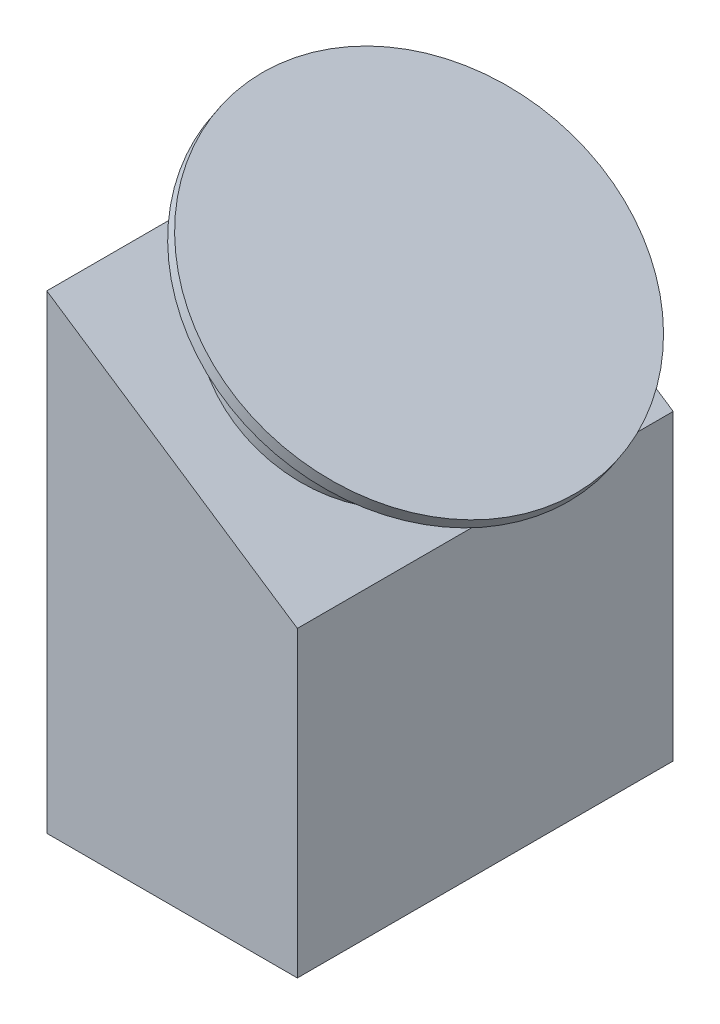
ISO-10303-21;
HEADER;
FILE_DESCRIPTION(('STEP AP214'),'2;1');
FILE_NAME('part.step','',(''),(''),'','','');
FILE_SCHEMA(('AUTOMOTIVE_DESIGN { 1 0 10303 214 1 1 1 1 }'));
ENDSEC;
DATA;
#1=APPLICATION_CONTEXT('core data for automotive mechanical design processes');
#2=APPLICATION_PROTOCOL_DEFINITION('international standard','automotive_design',2000,#1);
#3=PRODUCT_CONTEXT('',#1,'mechanical');
#4=PRODUCT('Part','Part','',(#3));
#5=PRODUCT_RELATED_PRODUCT_CATEGORY('part','',(#4));
#6=PRODUCT_DEFINITION_FORMATION('','',#4);
#7=PRODUCT_DEFINITION_CONTEXT('part definition',#1,'design');
#8=PRODUCT_DEFINITION('design','',#6,#7);
#9=PRODUCT_DEFINITION_SHAPE('','',#8);
#10=(LENGTH_UNIT() NAMED_UNIT(*) SI_UNIT(.MILLI.,.METRE.));
#11=(NAMED_UNIT(*) PLANE_ANGLE_UNIT() SI_UNIT($,.RADIAN.));
#12=(NAMED_UNIT(*) SI_UNIT($,.STERADIAN.) SOLID_ANGLE_UNIT());
#13=UNCERTAINTY_MEASURE_WITH_UNIT(LENGTH_MEASURE(1.E-05),#10,'distance_accuracy_value','');
#14=(GEOMETRIC_REPRESENTATION_CONTEXT(3) GLOBAL_UNCERTAINTY_ASSIGNED_CONTEXT((#13)) GLOBAL_UNIT_ASSIGNED_CONTEXT((#10,
#11,#12)) REPRESENTATION_CONTEXT('',''));
#15=CARTESIAN_POINT('',(0.,0.,0.));
#16=DIRECTION('',(0.,0.,1.));
#17=DIRECTION('',(1.,0.,0.));
#18=AXIS2_PLACEMENT_3D('',#15,#16,#17);
#19=CARTESIAN_POINT('',(0.,-75.,120.));
#20=DIRECTION('',(0.,1.,0.));
#21=DIRECTION('',(0.,0.,1.));
#22=AXIS2_PLACEMENT_3D('',#19,#20,#21);
#23=PLANE('',#22);
#24=DIRECTION('',(1.,0.,0.));
#25=VECTOR('',#24,1.);
#26=CARTESIAN_POINT('',(0.,-75.,0.));
#27=LINE('',#26,#25);
#28=CARTESIAN_POINT('',(-40.,-75.,0.));
#29=VERTEX_POINT('',#28);
#30=CARTESIAN_POINT('',(40.,-75.,0.));
#31=VERTEX_POINT('',#30);
#32=EDGE_CURVE('E150',#29,#31,#27,.T.);
#33=ORIENTED_EDGE('',*,*,#32,.T.);
#34=DIRECTION('',(0.,0.,-1.));
#35=VECTOR('',#34,1.);
#36=CARTESIAN_POINT('',(40.,-75.,120.));
#37=LINE('',#36,#35);
#38=CARTESIAN_POINT('',(40.,-75.,120.));
#39=VERTEX_POINT('',#38);
#40=EDGE_CURVE('E142',#39,#31,#37,.T.);
#41=ORIENTED_EDGE('',*,*,#40,.F.);
#42=DIRECTION('',(1.,0.,0.));
#43=VECTOR('',#42,1.);
#44=CARTESIAN_POINT('',(0.,-75.,120.));
#45=LINE('',#44,#43);
#46=CARTESIAN_POINT('',(-40.,-75.,120.));
#47=VERTEX_POINT('',#46);
#48=EDGE_CURVE('E133',#47,#39,#45,.T.);
#49=ORIENTED_EDGE('',*,*,#48,.F.);
#50=DIRECTION('',(0.,0.,-1.));
#51=VECTOR('',#50,1.);
#52=CARTESIAN_POINT('',(-40.,-75.,120.));
#53=LINE('',#52,#51);
#54=EDGE_CURVE('E99',#47,#29,#53,.T.);
#55=ORIENTED_EDGE('',*,*,#54,.T.);
#56=EDGE_LOOP('',(#33,#41,#49,#55));
#57=FACE_BOUND('',#56,.T.);
#58=ADVANCED_FACE('F40',(#57),#23,.F.);
#59=CARTESIAN_POINT('',(40.,0.,120.));
#60=DIRECTION('',(-1.,0.,0.));
#61=DIRECTION('',(0.,0.,1.));
#62=AXIS2_PLACEMENT_3D('',#59,#60,#61);
#63=PLANE('',#62);
#64=DIRECTION('',(0.,1.,0.));
#65=VECTOR('',#64,1.);
#66=CARTESIAN_POINT('',(40.,0.,0.));
#67=LINE('',#66,#65);
#68=CARTESIAN_POINT('',(40.,21.6666666666666,0.));
#69=VERTEX_POINT('',#68);
#70=EDGE_CURVE('E139',#31,#69,#67,.T.);
#71=ORIENTED_EDGE('',*,*,#70,.T.);
#72=DIRECTION('',(0.,0.,-1.));
#73=VECTOR('',#72,1.);
#74=CARTESIAN_POINT('',(40.,21.6666666666666,120.));
#75=LINE('',#74,#73);
#76=CARTESIAN_POINT('',(40.,21.6666666666666,120.));
#77=VERTEX_POINT('',#76);
#78=EDGE_CURVE('E137',#77,#69,#75,.T.);
#79=ORIENTED_EDGE('',*,*,#78,.F.);
#80=DIRECTION('',(0.,1.,0.));
#81=VECTOR('',#80,1.);
#82=CARTESIAN_POINT('',(40.,0.,120.));
#83=LINE('',#82,#81);
#84=EDGE_CURVE('E125',#39,#77,#83,.T.);
#85=ORIENTED_EDGE('',*,*,#84,.F.);
#86=ORIENTED_EDGE('',*,*,#40,.T.);
#87=EDGE_LOOP('',(#71,#79,#85,#86));
#88=FACE_BOUND('',#87,.T.);
#89=ADVANCED_FACE('F138',(#88),#63,.F.);
#90=CARTESIAN_POINT('',(22.3076923076923,33.4615384615385,120.));
#91=DIRECTION('',(0.554700196225229,0.832050294337844,0.));
#92=DIRECTION('',(-0.832050294337844,0.554700196225229,0.));
#93=AXIS2_PLACEMENT_3D('',#90,#91,#92);
#94=PLANE('',#93);
#95=CARTESIAN_POINT('',(0.,48.3333333333333,60.));
#96=DIRECTION('',(0.554700196225229,0.832050294337844,0.));
#97=DIRECTION('',(-0.832050294337844,0.554700196225229,0.));
#98=AXIS2_PLACEMENT_3D('',#95,#96,#97);
#99=CIRCLE('',#98,40.);
#100=CARTESIAN_POINT('',(-33.2820117735137,70.5213411823425,60.));
#101=VERTEX_POINT('',#100);
#102=EDGE_CURVE('E161',#101,#101,#99,.T.);
#103=ORIENTED_EDGE('',*,*,#102,.F.);
#104=EDGE_LOOP('',(#103));
#105=FACE_BOUND('',#104,.T.);
#106=DIRECTION('',(0.832050294337844,-0.554700196225229,0.));
#107=VECTOR('',#106,1.);
#108=CARTESIAN_POINT('',(22.3076923076923,33.4615384615385,0.));
#109=LINE('',#108,#107);
#110=CARTESIAN_POINT('',(-40.,75.,0.));
#111=VERTEX_POINT('',#110);
#112=EDGE_CURVE('E154',#111,#69,#109,.T.);
#113=ORIENTED_EDGE('',*,*,#112,.F.);
#114=DIRECTION('',(0.,0.,-1.));
#115=VECTOR('',#114,1.);
#116=CARTESIAN_POINT('',(-40.,75.,120.));
#117=LINE('',#116,#115);
#118=CARTESIAN_POINT('',(-40.,75.,120.));
#119=VERTEX_POINT('',#118);
#120=EDGE_CURVE('E113',#119,#111,#117,.T.);
#121=ORIENTED_EDGE('',*,*,#120,.F.);
#122=DIRECTION('',(0.832050294337844,-0.554700196225229,0.));
#123=VECTOR('',#122,1.);
#124=CARTESIAN_POINT('',(22.3076923076923,33.4615384615385,120.));
#125=LINE('',#124,#123);
#126=EDGE_CURVE('E132',#119,#77,#125,.T.);
#127=ORIENTED_EDGE('',*,*,#126,.T.);
#128=ORIENTED_EDGE('',*,*,#78,.T.);
#129=EDGE_LOOP('',(#113,#121,#127,#128));
#130=FACE_BOUND('',#129,.T.);
#131=ADVANCED_FACE('F144',(#105,#130),#94,.T.);
#132=CARTESIAN_POINT('',(-40.,0.,120.));
#133=DIRECTION('',(-1.,0.,0.));
#134=DIRECTION('',(0.,0.,1.));
#135=AXIS2_PLACEMENT_3D('',#132,#133,#134);
#136=PLANE('',#135);
#137=DIRECTION('',(0.,1.,0.));
#138=VECTOR('',#137,1.);
#139=CARTESIAN_POINT('',(-40.,0.,0.));
#140=LINE('',#139,#138);
#141=EDGE_CURVE('E156',#29,#111,#140,.T.);
#142=ORIENTED_EDGE('',*,*,#141,.F.);
#143=ORIENTED_EDGE('',*,*,#54,.F.);
#144=DIRECTION('',(0.,1.,0.));
#145=VECTOR('',#144,1.);
#146=CARTESIAN_POINT('',(-40.,0.,120.));
#147=LINE('',#146,#145);
#148=EDGE_CURVE('E145',#47,#119,#147,.T.);
#149=ORIENTED_EDGE('',*,*,#148,.T.);
#150=ORIENTED_EDGE('',*,*,#120,.T.);
#151=EDGE_LOOP('',(#142,#143,#149,#150));
#152=FACE_BOUND('',#151,.T.);
#153=ADVANCED_FACE('F343',(#152),#136,.T.);
#154=CARTESIAN_POINT('',(0.,0.,120.));
#155=DIRECTION('',(0.,0.,1.));
#156=DIRECTION('',(1.,0.,0.));
#157=AXIS2_PLACEMENT_3D('',#154,#155,#156);
#158=PLANE('',#157);
#159=ORIENTED_EDGE('',*,*,#48,.T.);
#160=ORIENTED_EDGE('',*,*,#84,.T.);
#161=ORIENTED_EDGE('',*,*,#126,.F.);
#162=ORIENTED_EDGE('',*,*,#148,.F.);
#163=EDGE_LOOP('',(#159,#160,#161,#162));
#164=FACE_BOUND('',#163,.T.);
#165=ADVANCED_FACE('F129',(#164),#158,.T.);
#166=CARTESIAN_POINT('',(0.,0.,0.));
#167=DIRECTION('',(0.,0.,1.));
#168=DIRECTION('',(1.,0.,0.));
#169=AXIS2_PLACEMENT_3D('',#166,#167,#168);
#170=PLANE('',#169);
#171=ORIENTED_EDGE('',*,*,#32,.F.);
#172=ORIENTED_EDGE('',*,*,#141,.T.);
#173=ORIENTED_EDGE('',*,*,#112,.T.);
#174=ORIENTED_EDGE('',*,*,#70,.F.);
#175=EDGE_LOOP('',(#171,#172,#173,#174));
#176=FACE_BOUND('',#175,.T.);
#177=ADVANCED_FACE('F325',(#176),#170,.F.);
#178=CARTESIAN_POINT('',(16.6410058867569,73.2948421634686,60.));
#179=DIRECTION('',(-0.554700196225229,-0.832050294337844,0.));
#180=DIRECTION('',(0.832050294337844,-0.554700196225229,0.));
#181=AXIS2_PLACEMENT_3D('',#178,#179,#180);
#182=CYLINDRICAL_SURFACE('',#181,40.);
#183=CARTESIAN_POINT('',(16.6410058867569,73.2948421634686,60.));
#184=DIRECTION('',(0.554700196225229,0.832050294337844,0.));
#185=DIRECTION('',(-0.832050294337844,0.554700196225229,0.));
#186=AXIS2_PLACEMENT_3D('',#183,#184,#185);
#187=CIRCLE('',#186,40.);
#188=CARTESIAN_POINT('',(-16.6410058867568,95.4828500124778,60.));
#189=VERTEX_POINT('',#188);
#190=EDGE_CURVE('E152',#189,#189,#187,.T.);
#191=ORIENTED_EDGE('',*,*,#190,.F.);
#192=EDGE_LOOP('',(#191));
#193=FACE_BOUND('',#192,.T.);
#194=ORIENTED_EDGE('',*,*,#102,.T.);
#195=EDGE_LOOP('',(#194));
#196=FACE_BOUND('',#195,.T.);
#197=ADVANCED_FACE('F208',(#193,#196),#182,.T.);
#198=CARTESIAN_POINT('',(18.8598066716578,76.62304334082,60.));
#199=DIRECTION('',(-0.554700196225229,-0.832050294337844,0.));
#200=DIRECTION('',(0.832050294337844,-0.554700196225229,0.));
#201=AXIS2_PLACEMENT_3D('',#198,#199,#200);
#202=CYLINDRICAL_SURFACE('',#201,60.);
#203=CARTESIAN_POINT('',(18.8598066716578,76.62304334082,60.));
#204=DIRECTION('',(0.554700196225229,0.832050294337844,0.));
#205=DIRECTION('',(-0.832050294337844,0.554700196225229,0.));
#206=AXIS2_PLACEMENT_3D('',#203,#204,#205);
#207=CIRCLE('',#206,60.);
#208=CARTESIAN_POINT('',(-31.0632109886128,109.905055114334,60.));
#209=VERTEX_POINT('',#208);
#210=EDGE_CURVE('E196',#209,#209,#207,.T.);
#211=ORIENTED_EDGE('',*,*,#210,.F.);
#212=EDGE_LOOP('',(#211));
#213=FACE_BOUND('',#212,.T.);
#214=CARTESIAN_POINT('',(16.6410058867569,73.2948421634687,60.));
#215=DIRECTION('',(0.554700196225229,0.832050294337844,0.));
#216=DIRECTION('',(-0.832050294337844,0.554700196225229,0.));
#217=AXIS2_PLACEMENT_3D('',#214,#215,#216);
#218=CIRCLE('',#217,60.);
#219=CARTESIAN_POINT('',(-33.2820117735137,106.576853936982,60.));
#220=VERTEX_POINT('',#219);
#221=EDGE_CURVE('E197',#220,#220,#218,.T.);
#222=ORIENTED_EDGE('',*,*,#221,.T.);
#223=EDGE_LOOP('',(#222));
#224=FACE_BOUND('',#223,.T.);
#225=ADVANCED_FACE('F205',(#213,#224),#202,.T.);
#226=CARTESIAN_POINT('',(18.8598066716578,76.62304334082,60.));
#227=DIRECTION('',(0.554700196225229,0.832050294337844,0.));
#228=DIRECTION('',(-0.832050294337844,0.554700196225229,0.));
#229=AXIS2_PLACEMENT_3D('',#226,#227,#228);
#230=PLANE('',#229);
#231=ORIENTED_EDGE('',*,*,#210,.T.);
#232=EDGE_LOOP('',(#231));
#233=FACE_BOUND('',#232,.T.);
#234=ADVANCED_FACE('F203',(#233),#230,.T.);
#235=CARTESIAN_POINT('',(16.6410058867569,73.2948421634687,60.));
#236=DIRECTION('',(0.554700196225229,0.832050294337844,0.));
#237=DIRECTION('',(-0.832050294337844,0.554700196225229,0.));
#238=AXIS2_PLACEMENT_3D('',#235,#236,#237);
#239=PLANE('',#238);
#240=ORIENTED_EDGE('',*,*,#190,.T.);
#241=EDGE_LOOP('',(#240));
#242=FACE_BOUND('',#241,.T.);
#243=ORIENTED_EDGE('',*,*,#221,.F.);
#244=EDGE_LOOP('',(#243));
#245=FACE_BOUND('',#244,.T.);
#246=ADVANCED_FACE('F212',(#242,#245),#239,.F.);
#247=CLOSED_SHELL('',(#58,#89,#131,#153,#165,#177,#197,#225,#234,#246));
#248=CARTESIAN_POINT('',(16.6410058867569,73.2948421634686,60.));
#249=DIRECTION('',(-0.554700196225229,-0.832050294337844,0.));
#250=DIRECTION('',(0.832050294337844,-0.554700196225229,0.));
#251=AXIS2_PLACEMENT_3D('',#248,#249,#250);
#252=CYLINDRICAL_SURFACE('',#251,37.);
#253=CARTESIAN_POINT('',(-1.66410058867567,45.8371824503198,60.));
#254=DIRECTION('',(0.554700196225229,0.832050294337844,0.));
#255=DIRECTION('',(-0.832050294337844,0.554700196225229,0.));
#256=AXIS2_PLACEMENT_3D('',#253,#254,#255);
#257=CIRCLE('',#256,37.);
#258=CARTESIAN_POINT('',(-32.4499614791759,66.3610897106533,60.));
#259=VERTEX_POINT('',#258);
#260=EDGE_CURVE('E44',#259,#259,#257,.T.);
#261=ORIENTED_EDGE('',*,*,#260,.F.);
#262=EDGE_LOOP('',(#261));
#263=FACE_BOUND('',#262,.T.);
#264=CARTESIAN_POINT('',(17.1957060829821,74.1268924578065,60.));
#265=DIRECTION('',(0.554700196225229,0.832050294337844,0.));
#266=DIRECTION('',(-0.832050294337844,0.554700196225229,0.));
#267=AXIS2_PLACEMENT_3D('',#264,#265,#266);
#268=CIRCLE('',#267,37.);
#269=CARTESIAN_POINT('',(-13.5901548075181,94.65079971814,60.));
#270=VERTEX_POINT('',#269);
#271=EDGE_CURVE('E182',#270,#270,#268,.F.);
#272=ORIENTED_EDGE('',*,*,#271,.F.);
#273=EDGE_LOOP('',(#272));
#274=FACE_BOUND('',#273,.T.);
#275=ADVANCED_FACE('F229',(#263,#274),#252,.F.);
#276=CARTESIAN_POINT('',(0.,-72.,120.));
#277=DIRECTION('',(0.,1.,0.));
#278=DIRECTION('',(0.,0.,1.));
#279=AXIS2_PLACEMENT_3D('',#276,#277,#278);
#280=PLANE('',#279);
#281=DIRECTION('',(1.,0.,0.));
#282=VECTOR('',#281,1.);
#283=CARTESIAN_POINT('',(0.,-72.,3.));
#284=LINE('',#283,#282);
#285=CARTESIAN_POINT('',(-37.,-72.,3.));
#286=VERTEX_POINT('',#285);
#287=CARTESIAN_POINT('',(37.,-72.,3.));
#288=VERTEX_POINT('',#287);
#289=EDGE_CURVE('E180',#286,#288,#284,.T.);
#290=ORIENTED_EDGE('',*,*,#289,.F.);
#291=DIRECTION('',(0.,0.,-1.));
#292=VECTOR('',#291,1.);
#293=CARTESIAN_POINT('',(-37.,-72.,120.));
#294=LINE('',#293,#292);
#295=CARTESIAN_POINT('',(-37.,-72.,117.));
#296=VERTEX_POINT('',#295);
#297=EDGE_CURVE('E90',#296,#286,#294,.T.);
#298=ORIENTED_EDGE('',*,*,#297,.F.);
#299=DIRECTION('',(1.,0.,0.));
#300=VECTOR('',#299,1.);
#301=CARTESIAN_POINT('',(0.,-72.,117.));
#302=LINE('',#301,#300);
#303=CARTESIAN_POINT('',(37.,-72.,117.));
#304=VERTEX_POINT('',#303);
#305=EDGE_CURVE('E165',#296,#304,#302,.T.);
#306=ORIENTED_EDGE('',*,*,#305,.T.);
#307=DIRECTION('',(0.,0.,-1.));
#308=VECTOR('',#307,1.);
#309=CARTESIAN_POINT('',(37.,-72.,120.));
#310=LINE('',#309,#308);
#311=EDGE_CURVE('E176',#304,#288,#310,.T.);
#312=ORIENTED_EDGE('',*,*,#311,.T.);
#313=EDGE_LOOP('',(#290,#298,#306,#312));
#314=FACE_BOUND('',#313,.T.);
#315=ADVANCED_FACE('F232',(#314),#280,.T.);
#316=CARTESIAN_POINT('',(37.,0.,120.));
#317=DIRECTION('',(-1.,0.,0.));
#318=DIRECTION('',(0.,0.,1.));
#319=AXIS2_PLACEMENT_3D('',#316,#317,#318);
#320=PLANE('',#319);
#321=DIRECTION('',(0.,1.,0.));
#322=VECTOR('',#321,1.);
#323=CARTESIAN_POINT('',(37.,0.,3.));
#324=LINE('',#323,#322);
#325=CARTESIAN_POINT('',(37.,20.0611153912027,3.));
#326=VERTEX_POINT('',#325);
#327=EDGE_CURVE('E60',#288,#326,#324,.T.);
#328=ORIENTED_EDGE('',*,*,#327,.F.);
#329=ORIENTED_EDGE('',*,*,#311,.F.);
#330=DIRECTION('',(0.,1.,0.));
#331=VECTOR('',#330,1.);
#332=CARTESIAN_POINT('',(37.,0.,117.));
#333=LINE('',#332,#331);
#334=CARTESIAN_POINT('',(37.,20.0611153912027,117.));
#335=VERTEX_POINT('',#334);
#336=EDGE_CURVE('E83',#304,#335,#333,.T.);
#337=ORIENTED_EDGE('',*,*,#336,.T.);
#338=DIRECTION('',(0.,0.,-1.));
#339=VECTOR('',#338,1.);
#340=CARTESIAN_POINT('',(37.,20.0611153912027,120.));
#341=LINE('',#340,#339);
#342=EDGE_CURVE('E172',#335,#326,#341,.T.);
#343=ORIENTED_EDGE('',*,*,#342,.T.);
#344=EDGE_LOOP('',(#328,#329,#337,#343));
#345=FACE_BOUND('',#344,.T.);
#346=ADVANCED_FACE('F237',(#345),#320,.T.);
#347=CARTESIAN_POINT('',(20.6435917190166,30.9653875785249,120.));
#348=DIRECTION('',(0.554700196225229,0.832050294337844,0.));
#349=DIRECTION('',(-0.832050294337844,0.554700196225229,0.));
#350=AXIS2_PLACEMENT_3D('',#347,#348,#349);
#351=PLANE('',#350);
#352=ORIENTED_EDGE('',*,*,#260,.T.);
#353=EDGE_LOOP('',(#352));
#354=FACE_BOUND('',#353,.T.);
#355=DIRECTION('',(0.832050294337844,-0.554700196225229,0.));
#356=VECTOR('',#355,1.);
#357=CARTESIAN_POINT('',(20.6435917190166,30.9653875785249,3.));
#358=LINE('',#357,#356);
#359=CARTESIAN_POINT('',(-37.,69.394448724536,3.));
#360=VERTEX_POINT('',#359);
#361=EDGE_CURVE('E11',#360,#326,#358,.T.);
#362=ORIENTED_EDGE('',*,*,#361,.T.);
#363=ORIENTED_EDGE('',*,*,#342,.F.);
#364=DIRECTION('',(0.832050294337844,-0.554700196225229,0.));
#365=VECTOR('',#364,1.);
#366=CARTESIAN_POINT('',(20.6435917190166,30.9653875785249,117.));
#367=LINE('',#366,#365);
#368=CARTESIAN_POINT('',(-37.,69.394448724536,117.));
#369=VERTEX_POINT('',#368);
#370=EDGE_CURVE('E174',#369,#335,#367,.T.);
#371=ORIENTED_EDGE('',*,*,#370,.F.);
#372=DIRECTION('',(0.,0.,-1.));
#373=VECTOR('',#372,1.);
#374=CARTESIAN_POINT('',(-37.,69.394448724536,120.));
#375=LINE('',#374,#373);
#376=EDGE_CURVE('E167',#369,#360,#375,.T.);
#377=ORIENTED_EDGE('',*,*,#376,.T.);
#378=EDGE_LOOP('',(#362,#363,#371,#377));
#379=FACE_BOUND('',#378,.T.);
#380=ADVANCED_FACE('F241',(#354,#379),#351,.F.);
#381=CARTESIAN_POINT('',(-37.,0.,120.));
#382=DIRECTION('',(-1.,0.,0.));
#383=DIRECTION('',(0.,0.,1.));
#384=AXIS2_PLACEMENT_3D('',#381,#382,#383);
#385=PLANE('',#384);
#386=DIRECTION('',(0.,1.,0.));
#387=VECTOR('',#386,1.);
#388=CARTESIAN_POINT('',(-37.,0.,3.));
#389=LINE('',#388,#387);
#390=EDGE_CURVE('E51',#286,#360,#389,.T.);
#391=ORIENTED_EDGE('',*,*,#390,.T.);
#392=ORIENTED_EDGE('',*,*,#376,.F.);
#393=DIRECTION('',(0.,1.,0.));
#394=VECTOR('',#393,1.);
#395=CARTESIAN_POINT('',(-37.,0.,117.));
#396=LINE('',#395,#394);
#397=EDGE_CURVE('E169',#296,#369,#396,.T.);
#398=ORIENTED_EDGE('',*,*,#397,.F.);
#399=ORIENTED_EDGE('',*,*,#297,.T.);
#400=EDGE_LOOP('',(#391,#392,#398,#399));
#401=FACE_BOUND('',#400,.T.);
#402=ADVANCED_FACE('F244',(#401),#385,.F.);
#403=CARTESIAN_POINT('',(0.,0.,117.));
#404=DIRECTION('',(0.,0.,1.));
#405=DIRECTION('',(1.,0.,0.));
#406=AXIS2_PLACEMENT_3D('',#403,#404,#405);
#407=PLANE('',#406);
#408=ORIENTED_EDGE('',*,*,#305,.F.);
#409=ORIENTED_EDGE('',*,*,#397,.T.);
#410=ORIENTED_EDGE('',*,*,#370,.T.);
#411=ORIENTED_EDGE('',*,*,#336,.F.);
#412=EDGE_LOOP('',(#408,#409,#410,#411));
#413=FACE_BOUND('',#412,.T.);
#414=ADVANCED_FACE('F247',(#413),#407,.F.);
#415=CARTESIAN_POINT('',(0.,0.,3.));
#416=DIRECTION('',(0.,0.,1.));
#417=DIRECTION('',(1.,0.,0.));
#418=AXIS2_PLACEMENT_3D('',#415,#416,#417);
#419=PLANE('',#418);
#420=ORIENTED_EDGE('',*,*,#289,.T.);
#421=ORIENTED_EDGE('',*,*,#327,.T.);
#422=ORIENTED_EDGE('',*,*,#361,.F.);
#423=ORIENTED_EDGE('',*,*,#390,.F.);
#424=EDGE_LOOP('',(#420,#421,#422,#423));
#425=FACE_BOUND('',#424,.T.);
#426=ADVANCED_FACE('F249',(#425),#419,.T.);
#427=CARTESIAN_POINT('',(17.1957060829821,74.1268924578065,60.));
#428=DIRECTION('',(0.554700196225229,0.832050294337844,0.));
#429=DIRECTION('',(-0.832050294337844,0.554700196225229,0.));
#430=AXIS2_PLACEMENT_3D('',#427,#428,#429);
#431=PLANE('',#430);
#432=ORIENTED_EDGE('',*,*,#271,.T.);
#433=EDGE_LOOP('',(#432));
#434=FACE_BOUND('',#433,.T.);
#435=ADVANCED_FACE('F42',(#434),#431,.F.);
#436=CLOSED_SHELL('',(#275,#315,#346,#380,#402,#414,#426,#435));
#437=ORIENTED_CLOSED_SHELL('',*,#436,.T.);
#438=BREP_WITH_VOIDS('B2',#247,(#437));
#439=ADVANCED_BREP_SHAPE_REPRESENTATION('',(#18,#438),#14);
#440=SHAPE_DEFINITION_REPRESENTATION(#9,#439);
ENDSEC;
END-ISO-10303-21;
